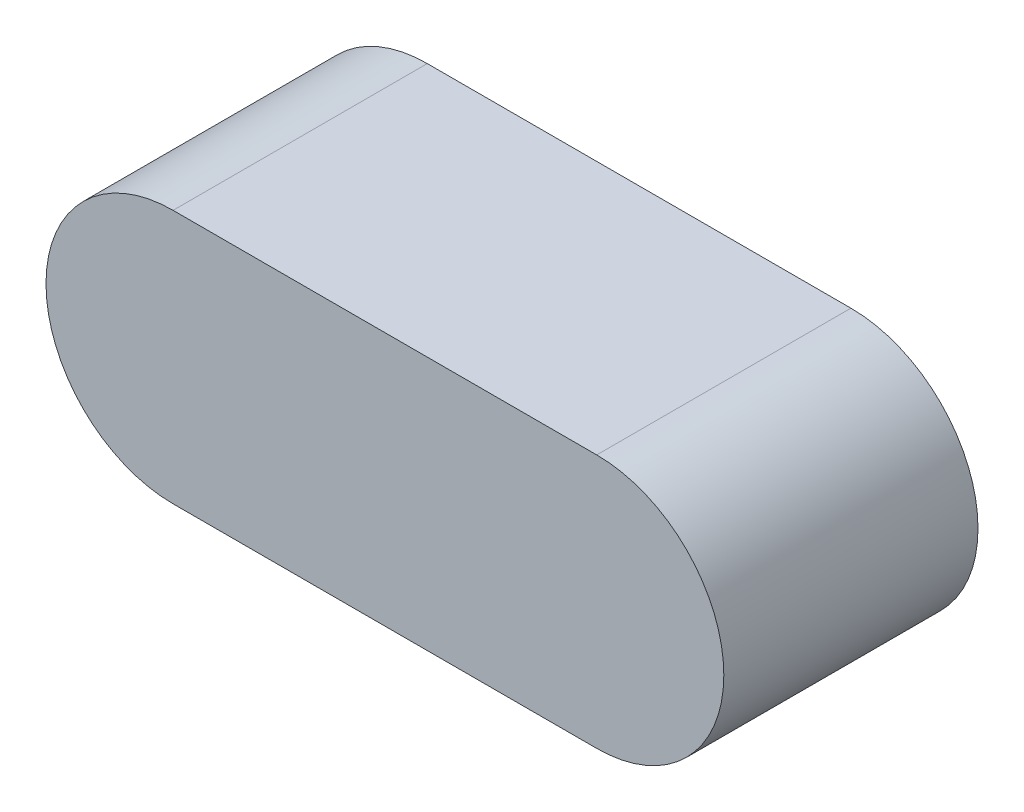
ISO-10303-21;
HEADER;
FILE_DESCRIPTION(('STEP AP214'),'2;1');
FILE_NAME('part.step','',(''),(''),'','','');
FILE_SCHEMA(('AUTOMOTIVE_DESIGN { 1 0 10303 214 1 1 1 1 }'));
ENDSEC;
DATA;
#1=APPLICATION_CONTEXT('core data for automotive mechanical design processes');
#2=APPLICATION_PROTOCOL_DEFINITION('international standard','automotive_design',2000,#1);
#3=PRODUCT_CONTEXT('',#1,'mechanical');
#4=PRODUCT('Part','Part','',(#3));
#5=PRODUCT_RELATED_PRODUCT_CATEGORY('part','',(#4));
#6=PRODUCT_DEFINITION_FORMATION('','',#4);
#7=PRODUCT_DEFINITION_CONTEXT('part definition',#1,'design');
#8=PRODUCT_DEFINITION('design','',#6,#7);
#9=PRODUCT_DEFINITION_SHAPE('','',#8);
#10=(LENGTH_UNIT() NAMED_UNIT(*) SI_UNIT(.MILLI.,.METRE.));
#11=(NAMED_UNIT(*) PLANE_ANGLE_UNIT() SI_UNIT($,.RADIAN.));
#12=(NAMED_UNIT(*) SI_UNIT($,.STERADIAN.) SOLID_ANGLE_UNIT());
#13=UNCERTAINTY_MEASURE_WITH_UNIT(LENGTH_MEASURE(1.E-05),#10,'distance_accuracy_value','');
#14=(GEOMETRIC_REPRESENTATION_CONTEXT(3) GLOBAL_UNCERTAINTY_ASSIGNED_CONTEXT((#13)) GLOBAL_UNIT_ASSIGNED_CONTEXT((#10,
#11,#12)) REPRESENTATION_CONTEXT('',''));
#15=CARTESIAN_POINT('',(0.,0.,0.));
#16=DIRECTION('',(0.,0.,1.));
#17=DIRECTION('',(1.,0.,0.));
#18=AXIS2_PLACEMENT_3D('',#15,#16,#17);
#19=CARTESIAN_POINT('',(0.,0.,1.5));
#20=DIRECTION('',(0.,0.,-1.));
#21=DIRECTION('',(-1.,0.,0.));
#22=AXIS2_PLACEMENT_3D('',#19,#20,#21);
#23=CYLINDRICAL_SURFACE('',#22,1.5);
#24=CARTESIAN_POINT('',(0.,0.,-1.5));
#25=DIRECTION('',(0.,0.,1.));
#26=DIRECTION('',(1.,0.,0.));
#27=AXIS2_PLACEMENT_3D('',#24,#25,#26);
#28=CIRCLE('',#27,1.5);
#29=CARTESIAN_POINT('',(0.,1.5,-1.5));
#30=VERTEX_POINT('',#29);
#31=CARTESIAN_POINT('',(0.,-1.5,-1.5));
#32=VERTEX_POINT('',#31);
#33=EDGE_CURVE('E123',#30,#32,#28,.T.);
#34=ORIENTED_EDGE('',*,*,#33,.T.);
#35=DIRECTION('',(0.,0.,-1.));
#36=VECTOR('',#35,1.);
#37=CARTESIAN_POINT('',(0.,-1.5,1.5));
#38=LINE('',#37,#36);
#39=CARTESIAN_POINT('',(0.,-1.5,1.5));
#40=VERTEX_POINT('',#39);
#41=EDGE_CURVE('E11',#40,#32,#38,.T.);
#42=ORIENTED_EDGE('',*,*,#41,.F.);
#43=CARTESIAN_POINT('',(0.,0.,1.5));
#44=DIRECTION('',(0.,0.,1.));
#45=DIRECTION('',(1.,0.,0.));
#46=AXIS2_PLACEMENT_3D('',#43,#44,#45);
#47=CIRCLE('',#46,1.5);
#48=CARTESIAN_POINT('',(0.,1.5,1.5));
#49=VERTEX_POINT('',#48);
#50=EDGE_CURVE('E107',#49,#40,#47,.T.);
#51=ORIENTED_EDGE('',*,*,#50,.F.);
#52=DIRECTION('',(0.,0.,-1.));
#53=VECTOR('',#52,1.);
#54=CARTESIAN_POINT('',(0.,1.5,1.5));
#55=LINE('',#54,#53);
#56=EDGE_CURVE('E119',#49,#30,#55,.T.);
#57=ORIENTED_EDGE('',*,*,#56,.T.);
#58=EDGE_LOOP('',(#34,#42,#51,#57));
#59=FACE_BOUND('',#58,.T.);
#60=ADVANCED_FACE('F47',(#59),#23,.T.);
#61=CARTESIAN_POINT('',(0.,-1.5,1.5));
#62=DIRECTION('',(0.,1.,0.));
#63=DIRECTION('',(-1.,0.,0.));
#64=AXIS2_PLACEMENT_3D('',#61,#62,#63);
#65=PLANE('',#64);
#66=DIRECTION('',(1.,0.,0.));
#67=VECTOR('',#66,1.);
#68=CARTESIAN_POINT('',(0.,-1.5,-1.5));
#69=LINE('',#68,#67);
#70=CARTESIAN_POINT('',(5.,-1.5,-1.5));
#71=VERTEX_POINT('',#70);
#72=EDGE_CURVE('E112',#32,#71,#69,.T.);
#73=ORIENTED_EDGE('',*,*,#72,.T.);
#74=DIRECTION('',(0.,0.,-1.));
#75=VECTOR('',#74,1.);
#76=CARTESIAN_POINT('',(5.,-1.5,1.5));
#77=LINE('',#76,#75);
#78=CARTESIAN_POINT('',(5.,-1.5,1.5));
#79=VERTEX_POINT('',#78);
#80=EDGE_CURVE('E56',#79,#71,#77,.T.);
#81=ORIENTED_EDGE('',*,*,#80,.F.);
#82=DIRECTION('',(1.,0.,0.));
#83=VECTOR('',#82,1.);
#84=CARTESIAN_POINT('',(0.,-1.5,1.5));
#85=LINE('',#84,#83);
#86=EDGE_CURVE('E102',#40,#79,#85,.T.);
#87=ORIENTED_EDGE('',*,*,#86,.F.);
#88=ORIENTED_EDGE('',*,*,#41,.T.);
#89=EDGE_LOOP('',(#73,#81,#87,#88));
#90=FACE_BOUND('',#89,.T.);
#91=ADVANCED_FACE('F111',(#90),#65,.F.);
#92=CARTESIAN_POINT('',(5.,0.,1.5));
#93=DIRECTION('',(0.,0.,-1.));
#94=DIRECTION('',(-1.,0.,0.));
#95=AXIS2_PLACEMENT_3D('',#92,#93,#94);
#96=CYLINDRICAL_SURFACE('',#95,1.5);
#97=CARTESIAN_POINT('',(5.,0.,-1.5));
#98=DIRECTION('',(0.,0.,1.));
#99=DIRECTION('',(1.,0.,0.));
#100=AXIS2_PLACEMENT_3D('',#97,#98,#99);
#101=CIRCLE('',#100,1.5);
#102=CARTESIAN_POINT('',(5.,1.5,-1.5));
#103=VERTEX_POINT('',#102);
#104=EDGE_CURVE('E86',#71,#103,#101,.T.);
#105=ORIENTED_EDGE('',*,*,#104,.T.);
#106=DIRECTION('',(0.,0.,-1.));
#107=VECTOR('',#106,1.);
#108=CARTESIAN_POINT('',(5.,1.5,1.5));
#109=LINE('',#108,#107);
#110=CARTESIAN_POINT('',(5.,1.5,1.5));
#111=VERTEX_POINT('',#110);
#112=EDGE_CURVE('E114',#111,#103,#109,.T.);
#113=ORIENTED_EDGE('',*,*,#112,.F.);
#114=CARTESIAN_POINT('',(5.,0.,1.5));
#115=DIRECTION('',(0.,0.,1.));
#116=DIRECTION('',(1.,0.,0.));
#117=AXIS2_PLACEMENT_3D('',#114,#115,#116);
#118=CIRCLE('',#117,1.5);
#119=EDGE_CURVE('E105',#79,#111,#118,.T.);
#120=ORIENTED_EDGE('',*,*,#119,.F.);
#121=ORIENTED_EDGE('',*,*,#80,.T.);
#122=EDGE_LOOP('',(#105,#113,#120,#121));
#123=FACE_BOUND('',#122,.T.);
#124=ADVANCED_FACE('F115',(#123),#96,.T.);
#125=CARTESIAN_POINT('',(0.,1.5,1.5));
#126=DIRECTION('',(0.,-1.,0.));
#127=DIRECTION('',(1.,0.,0.));
#128=AXIS2_PLACEMENT_3D('',#125,#126,#127);
#129=PLANE('',#128);
#130=DIRECTION('',(-1.,0.,0.));
#131=VECTOR('',#130,1.);
#132=CARTESIAN_POINT('',(0.,1.5,-1.5));
#133=LINE('',#132,#131);
#134=EDGE_CURVE('E93',#103,#30,#133,.T.);
#135=ORIENTED_EDGE('',*,*,#134,.T.);
#136=ORIENTED_EDGE('',*,*,#56,.F.);
#137=DIRECTION('',(-1.,0.,0.));
#138=VECTOR('',#137,1.);
#139=CARTESIAN_POINT('',(0.,1.5,1.5));
#140=LINE('',#139,#138);
#141=EDGE_CURVE('E67',#111,#49,#140,.T.);
#142=ORIENTED_EDGE('',*,*,#141,.F.);
#143=ORIENTED_EDGE('',*,*,#112,.T.);
#144=EDGE_LOOP('',(#135,#136,#142,#143));
#145=FACE_BOUND('',#144,.T.);
#146=ADVANCED_FACE('F136',(#145),#129,.F.);
#147=CARTESIAN_POINT('',(0.,0.,1.5));
#148=DIRECTION('',(0.,0.,1.));
#149=DIRECTION('',(1.,0.,0.));
#150=AXIS2_PLACEMENT_3D('',#147,#148,#149);
#151=PLANE('',#150);
#152=ORIENTED_EDGE('',*,*,#50,.T.);
#153=ORIENTED_EDGE('',*,*,#86,.T.);
#154=ORIENTED_EDGE('',*,*,#119,.T.);
#155=ORIENTED_EDGE('',*,*,#141,.T.);
#156=EDGE_LOOP('',(#152,#153,#154,#155));
#157=FACE_BOUND('',#156,.T.);
#158=ADVANCED_FACE('F103',(#157),#151,.T.);
#159=CARTESIAN_POINT('',(0.,0.,-1.5));
#160=DIRECTION('',(0.,0.,1.));
#161=DIRECTION('',(1.,0.,0.));
#162=AXIS2_PLACEMENT_3D('',#159,#160,#161);
#163=PLANE('',#162);
#164=ORIENTED_EDGE('',*,*,#33,.F.);
#165=ORIENTED_EDGE('',*,*,#134,.F.);
#166=ORIENTED_EDGE('',*,*,#104,.F.);
#167=ORIENTED_EDGE('',*,*,#72,.F.);
#168=EDGE_LOOP('',(#164,#165,#166,#167));
#169=FACE_BOUND('',#168,.T.);
#170=ADVANCED_FACE('F139',(#169),#163,.F.);
#171=CLOSED_SHELL('',(#60,#91,#124,#146,#158,#170));
#172=MANIFOLD_SOLID_BREP('B2',#171);
#173=ADVANCED_BREP_SHAPE_REPRESENTATION('',(#18,#172),#14);
#174=SHAPE_DEFINITION_REPRESENTATION(#9,#173);
ENDSEC;
END-ISO-10303-21;
